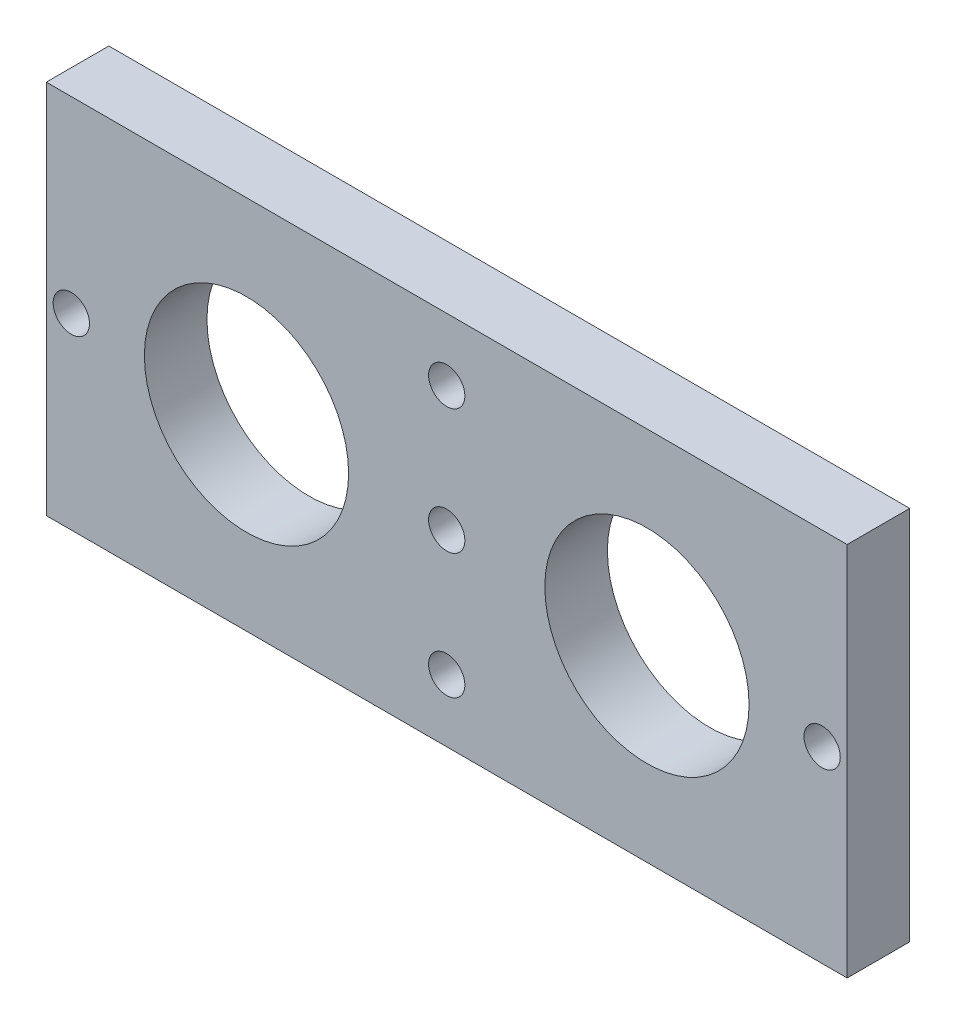
ISO-10303-21;
HEADER;
FILE_DESCRIPTION(('STEP AP214'),'2;1');
FILE_NAME('part.step','',(''),(''),'','','');
FILE_SCHEMA(('AUTOMOTIVE_DESIGN { 1 0 10303 214 1 1 1 1 }'));
ENDSEC;
DATA;
#1=APPLICATION_CONTEXT('core data for automotive mechanical design processes');
#2=APPLICATION_PROTOCOL_DEFINITION('international standard','automotive_design',2000,#1);
#3=PRODUCT_CONTEXT('',#1,'mechanical');
#4=PRODUCT('Part','Part','',(#3));
#5=PRODUCT_RELATED_PRODUCT_CATEGORY('part','',(#4));
#6=PRODUCT_DEFINITION_FORMATION('','',#4);
#7=PRODUCT_DEFINITION_CONTEXT('part definition',#1,'design');
#8=PRODUCT_DEFINITION('design','',#6,#7);
#9=PRODUCT_DEFINITION_SHAPE('','',#8);
#10=(LENGTH_UNIT() NAMED_UNIT(*) SI_UNIT(.MILLI.,.METRE.));
#11=(NAMED_UNIT(*) PLANE_ANGLE_UNIT() SI_UNIT($,.RADIAN.));
#12=(NAMED_UNIT(*) SI_UNIT($,.STERADIAN.) SOLID_ANGLE_UNIT());
#13=UNCERTAINTY_MEASURE_WITH_UNIT(LENGTH_MEASURE(1.E-05),#10,'distance_accuracy_value','');
#14=(GEOMETRIC_REPRESENTATION_CONTEXT(3) GLOBAL_UNCERTAINTY_ASSIGNED_CONTEXT((#13)) GLOBAL_UNIT_ASSIGNED_CONTEXT((#10,
#11,#12)) REPRESENTATION_CONTEXT('',''));
#15=CARTESIAN_POINT('',(0.,0.,0.));
#16=DIRECTION('',(0.,0.,1.));
#17=DIRECTION('',(1.,0.,0.));
#18=AXIS2_PLACEMENT_3D('',#15,#16,#17);
#19=CARTESIAN_POINT('',(0.,0.,5.));
#20=DIRECTION('',(0.,0.,1.));
#21=DIRECTION('',(1.,0.,0.));
#22=AXIS2_PLACEMENT_3D('',#19,#20,#21);
#23=PLANE('',#22);
#24=CARTESIAN_POINT('',(23.1158708144224,5.41513714750296,5.));
#25=DIRECTION('',(0.,0.,1.));
#26=DIRECTION('',(1.,0.,0.));
#27=AXIS2_PLACEMENT_3D('',#24,#25,#26);
#28=CIRCLE('',#27,1.45);
#29=CARTESIAN_POINT('',(24.5658708144224,5.41513714750296,5.));
#30=VERTEX_POINT('',#29);
#31=EDGE_CURVE('E325',#30,#30,#28,.T.);
#32=ORIENTED_EDGE('',*,*,#31,.F.);
#33=EDGE_LOOP('',(#32));
#34=FACE_BOUND('',#33,.T.);
#35=CARTESIAN_POINT('',(-6.88412918557765,15.415137147503,5.));
#36=DIRECTION('',(0.,0.,1.));
#37=DIRECTION('',(1.,0.,0.));
#38=AXIS2_PLACEMENT_3D('',#35,#36,#37);
#39=CIRCLE('',#38,1.45);
#40=CARTESIAN_POINT('',(-5.43412918557764,15.415137147503,5.));
#41=VERTEX_POINT('',#40);
#42=EDGE_CURVE('E327',#41,#41,#39,.T.);
#43=ORIENTED_EDGE('',*,*,#42,.F.);
#44=EDGE_LOOP('',(#43));
#45=FACE_BOUND('',#44,.T.);
#46=CARTESIAN_POINT('',(-36.8841291855776,5.41513714750296,5.));
#47=DIRECTION('',(0.,0.,1.));
#48=DIRECTION('',(1.,0.,0.));
#49=AXIS2_PLACEMENT_3D('',#46,#47,#48);
#50=CIRCLE('',#49,1.45);
#51=CARTESIAN_POINT('',(-35.4341291855776,5.41513714750296,5.));
#52=VERTEX_POINT('',#51);
#53=EDGE_CURVE('E333',#52,#52,#50,.T.);
#54=ORIENTED_EDGE('',*,*,#53,.F.);
#55=EDGE_LOOP('',(#54));
#56=FACE_BOUND('',#55,.T.);
#57=CARTESIAN_POINT('',(-6.88412918557764,-4.58486285249704,5.));
#58=DIRECTION('',(0.,0.,1.));
#59=DIRECTION('',(1.,0.,0.));
#60=AXIS2_PLACEMENT_3D('',#57,#58,#59);
#61=CIRCLE('',#60,1.45);
#62=CARTESIAN_POINT('',(-5.43412918557764,-4.58486285249704,5.));
#63=VERTEX_POINT('',#62);
#64=EDGE_CURVE('E336',#63,#63,#61,.T.);
#65=ORIENTED_EDGE('',*,*,#64,.F.);
#66=EDGE_LOOP('',(#65));
#67=FACE_BOUND('',#66,.T.);
#68=CARTESIAN_POINT('',(-6.88412918557764,5.41513714750296,5.));
#69=DIRECTION('',(0.,0.,1.));
#70=DIRECTION('',(1.,0.,0.));
#71=AXIS2_PLACEMENT_3D('',#68,#69,#70);
#72=CIRCLE('',#71,1.45);
#73=CARTESIAN_POINT('',(-5.43412918557764,5.41513714750296,5.));
#74=VERTEX_POINT('',#73);
#75=EDGE_CURVE('E135',#74,#74,#72,.T.);
#76=ORIENTED_EDGE('',*,*,#75,.F.);
#77=EDGE_LOOP('',(#76));
#78=FACE_BOUND('',#77,.T.);
#79=CARTESIAN_POINT('',(9.11587081442235,5.41513714750296,5.));
#80=DIRECTION('',(0.,0.,1.));
#81=DIRECTION('',(1.,0.,0.));
#82=AXIS2_PLACEMENT_3D('',#79,#80,#81);
#83=CIRCLE('',#82,8.16);
#84=CARTESIAN_POINT('',(17.2758708144224,5.41513714750296,5.));
#85=VERTEX_POINT('',#84);
#86=EDGE_CURVE('E119',#85,#85,#83,.T.);
#87=ORIENTED_EDGE('',*,*,#86,.F.);
#88=EDGE_LOOP('',(#87));
#89=FACE_BOUND('',#88,.T.);
#90=DIRECTION('',(0.,1.,0.));
#91=VECTOR('',#90,1.);
#92=CARTESIAN_POINT('',(25.1158708144224,20.415137147503,5.));
#93=LINE('',#92,#91);
#94=CARTESIAN_POINT('',(25.1158708144224,-9.58486285249704,5.));
#95=VERTEX_POINT('',#94);
#96=CARTESIAN_POINT('',(25.1158708144224,20.415137147503,5.));
#97=VERTEX_POINT('',#96);
#98=EDGE_CURVE('E98',#95,#97,#93,.T.);
#99=ORIENTED_EDGE('',*,*,#98,.T.);
#100=DIRECTION('',(-1.,0.,0.));
#101=VECTOR('',#100,1.);
#102=CARTESIAN_POINT('',(-38.8841291855776,20.415137147503,5.));
#103=LINE('',#102,#101);
#104=CARTESIAN_POINT('',(-38.8841291855776,20.415137147503,5.));
#105=VERTEX_POINT('',#104);
#106=EDGE_CURVE('E93',#97,#105,#103,.T.);
#107=ORIENTED_EDGE('',*,*,#106,.T.);
#108=DIRECTION('',(0.,-1.,0.));
#109=VECTOR('',#108,1.);
#110=CARTESIAN_POINT('',(-38.8841291855776,20.415137147503,5.));
#111=LINE('',#110,#109);
#112=CARTESIAN_POINT('',(-38.8841291855776,-9.58486285249704,5.));
#113=VERTEX_POINT('',#112);
#114=EDGE_CURVE('E96',#105,#113,#111,.T.);
#115=ORIENTED_EDGE('',*,*,#114,.T.);
#116=DIRECTION('',(1.,0.,0.));
#117=VECTOR('',#116,1.);
#118=CARTESIAN_POINT('',(-38.8841291855776,-9.58486285249704,5.));
#119=LINE('',#118,#117);
#120=EDGE_CURVE('E63',#113,#95,#119,.T.);
#121=ORIENTED_EDGE('',*,*,#120,.T.);
#122=EDGE_LOOP('',(#99,#107,#115,#121));
#123=FACE_BOUND('',#122,.T.);
#124=CARTESIAN_POINT('',(-22.8841291855776,5.41513714750296,5.));
#125=DIRECTION('',(0.,0.,1.));
#126=DIRECTION('',(1.,0.,0.));
#127=AXIS2_PLACEMENT_3D('',#124,#125,#126);
#128=CIRCLE('',#127,8.16);
#129=CARTESIAN_POINT('',(-14.7241291855776,5.41513714750296,5.));
#130=VERTEX_POINT('',#129);
#131=EDGE_CURVE('E154',#130,#130,#128,.T.);
#132=ORIENTED_EDGE('',*,*,#131,.F.);
#133=EDGE_LOOP('',(#132));
#134=FACE_BOUND('',#133,.T.);
#135=ADVANCED_FACE('F43',(#34,#45,#56,#67,#78,#89,#123,#134),#23,.T.);
#136=CARTESIAN_POINT('',(0.,0.,0.));
#137=DIRECTION('',(0.,0.,1.));
#138=DIRECTION('',(1.,0.,0.));
#139=AXIS2_PLACEMENT_3D('',#136,#137,#138);
#140=PLANE('',#139);
#141=CARTESIAN_POINT('',(23.1158708144224,5.41513714750296,0.));
#142=DIRECTION('',(0.,0.,1.));
#143=DIRECTION('',(1.,0.,0.));
#144=AXIS2_PLACEMENT_3D('',#141,#142,#143);
#145=CIRCLE('',#144,1.45);
#146=CARTESIAN_POINT('',(24.5658708144224,5.41513714750296,0.));
#147=VERTEX_POINT('',#146);
#148=EDGE_CURVE('E47',#147,#147,#145,.T.);
#149=ORIENTED_EDGE('',*,*,#148,.T.);
#150=EDGE_LOOP('',(#149));
#151=FACE_BOUND('',#150,.T.);
#152=CARTESIAN_POINT('',(-6.88412918557765,15.415137147503,0.));
#153=DIRECTION('',(0.,0.,1.));
#154=DIRECTION('',(1.,0.,0.));
#155=AXIS2_PLACEMENT_3D('',#152,#153,#154);
#156=CIRCLE('',#155,1.45);
#157=CARTESIAN_POINT('',(-5.43412918557764,15.415137147503,0.));
#158=VERTEX_POINT('',#157);
#159=EDGE_CURVE('E142',#158,#158,#156,.T.);
#160=ORIENTED_EDGE('',*,*,#159,.T.);
#161=EDGE_LOOP('',(#160));
#162=FACE_BOUND('',#161,.T.);
#163=CARTESIAN_POINT('',(-36.8841291855776,5.41513714750296,0.));
#164=DIRECTION('',(0.,0.,1.));
#165=DIRECTION('',(1.,0.,0.));
#166=AXIS2_PLACEMENT_3D('',#163,#164,#165);
#167=CIRCLE('',#166,1.45);
#168=CARTESIAN_POINT('',(-35.4341291855776,5.41513714750296,0.));
#169=VERTEX_POINT('',#168);
#170=EDGE_CURVE('E139',#169,#169,#167,.T.);
#171=ORIENTED_EDGE('',*,*,#170,.T.);
#172=EDGE_LOOP('',(#171));
#173=FACE_BOUND('',#172,.T.);
#174=CARTESIAN_POINT('',(-6.88412918557764,-4.58486285249704,0.));
#175=DIRECTION('',(0.,0.,1.));
#176=DIRECTION('',(1.,0.,0.));
#177=AXIS2_PLACEMENT_3D('',#174,#175,#176);
#178=CIRCLE('',#177,1.45);
#179=CARTESIAN_POINT('',(-5.43412918557764,-4.58486285249704,0.));
#180=VERTEX_POINT('',#179);
#181=EDGE_CURVE('E134',#180,#180,#178,.T.);
#182=ORIENTED_EDGE('',*,*,#181,.T.);
#183=EDGE_LOOP('',(#182));
#184=FACE_BOUND('',#183,.T.);
#185=CARTESIAN_POINT('',(-6.88412918557764,5.41513714750296,0.));
#186=DIRECTION('',(0.,0.,1.));
#187=DIRECTION('',(1.,0.,0.));
#188=AXIS2_PLACEMENT_3D('',#185,#186,#187);
#189=CIRCLE('',#188,1.45);
#190=CARTESIAN_POINT('',(-5.43412918557764,5.41513714750296,0.));
#191=VERTEX_POINT('',#190);
#192=EDGE_CURVE('E130',#191,#191,#189,.T.);
#193=ORIENTED_EDGE('',*,*,#192,.T.);
#194=EDGE_LOOP('',(#193));
#195=FACE_BOUND('',#194,.T.);
#196=DIRECTION('',(0.,1.,0.));
#197=VECTOR('',#196,1.);
#198=CARTESIAN_POINT('',(25.1158708144224,20.415137147503,0.));
#199=LINE('',#198,#197);
#200=CARTESIAN_POINT('',(25.1158708144224,-9.58486285249704,0.));
#201=VERTEX_POINT('',#200);
#202=CARTESIAN_POINT('',(25.1158708144224,20.415137147503,0.));
#203=VERTEX_POINT('',#202);
#204=EDGE_CURVE('E115',#201,#203,#199,.T.);
#205=ORIENTED_EDGE('',*,*,#204,.F.);
#206=DIRECTION('',(1.,0.,0.));
#207=VECTOR('',#206,1.);
#208=CARTESIAN_POINT('',(-38.8841291855776,-9.58486285249704,0.));
#209=LINE('',#208,#207);
#210=CARTESIAN_POINT('',(-38.8841291855776,-9.58486285249704,0.));
#211=VERTEX_POINT('',#210);
#212=EDGE_CURVE('E86',#211,#201,#209,.T.);
#213=ORIENTED_EDGE('',*,*,#212,.F.);
#214=DIRECTION('',(0.,-1.,0.));
#215=VECTOR('',#214,1.);
#216=CARTESIAN_POINT('',(-38.8841291855776,20.415137147503,0.));
#217=LINE('',#216,#215);
#218=CARTESIAN_POINT('',(-38.8841291855776,20.415137147503,0.));
#219=VERTEX_POINT('',#218);
#220=EDGE_CURVE('E80',#219,#211,#217,.T.);
#221=ORIENTED_EDGE('',*,*,#220,.F.);
#222=DIRECTION('',(-1.,0.,0.));
#223=VECTOR('',#222,1.);
#224=CARTESIAN_POINT('',(-38.8841291855776,20.415137147503,0.));
#225=LINE('',#224,#223);
#226=EDGE_CURVE('E103',#203,#219,#225,.T.);
#227=ORIENTED_EDGE('',*,*,#226,.F.);
#228=EDGE_LOOP('',(#205,#213,#221,#227));
#229=FACE_BOUND('',#228,.T.);
#230=CARTESIAN_POINT('',(9.11587081442235,5.41513714750296,0.));
#231=DIRECTION('',(0.,0.,1.));
#232=DIRECTION('',(1.,0.,0.));
#233=AXIS2_PLACEMENT_3D('',#230,#231,#232);
#234=CIRCLE('',#233,8.16);
#235=CARTESIAN_POINT('',(17.2758708144224,5.41513714750296,0.));
#236=VERTEX_POINT('',#235);
#237=EDGE_CURVE('E160',#236,#236,#234,.T.);
#238=ORIENTED_EDGE('',*,*,#237,.T.);
#239=EDGE_LOOP('',(#238));
#240=FACE_BOUND('',#239,.T.);
#241=CARTESIAN_POINT('',(-22.8841291855776,5.41513714750296,0.));
#242=DIRECTION('',(0.,0.,1.));
#243=DIRECTION('',(1.,0.,0.));
#244=AXIS2_PLACEMENT_3D('',#241,#242,#243);
#245=CIRCLE('',#244,8.16);
#246=CARTESIAN_POINT('',(-14.7241291855776,5.41513714750296,0.));
#247=VERTEX_POINT('',#246);
#248=EDGE_CURVE('E149',#247,#247,#245,.T.);
#249=ORIENTED_EDGE('',*,*,#248,.T.);
#250=EDGE_LOOP('',(#249));
#251=FACE_BOUND('',#250,.T.);
#252=ADVANCED_FACE('F172',(#151,#162,#173,#184,#195,#229,#240,#251),#140,.F.);
#253=CARTESIAN_POINT('',(25.1158708144224,20.415137147503,5.));
#254=DIRECTION('',(-1.,0.,0.));
#255=DIRECTION('',(0.,0.,1.));
#256=AXIS2_PLACEMENT_3D('',#253,#254,#255);
#257=PLANE('',#256);
#258=ORIENTED_EDGE('',*,*,#204,.T.);
#259=DIRECTION('',(0.,0.,-1.));
#260=VECTOR('',#259,1.);
#261=CARTESIAN_POINT('',(25.1158708144224,20.415137147503,5.));
#262=LINE('',#261,#260);
#263=EDGE_CURVE('E11',#97,#203,#262,.T.);
#264=ORIENTED_EDGE('',*,*,#263,.F.);
#265=ORIENTED_EDGE('',*,*,#98,.F.);
#266=DIRECTION('',(0.,0.,-1.));
#267=VECTOR('',#266,1.);
#268=CARTESIAN_POINT('',(25.1158708144224,-9.58486285249704,5.));
#269=LINE('',#268,#267);
#270=EDGE_CURVE('E111',#95,#201,#269,.T.);
#271=ORIENTED_EDGE('',*,*,#270,.T.);
#272=EDGE_LOOP('',(#258,#264,#265,#271));
#273=FACE_BOUND('',#272,.T.);
#274=ADVANCED_FACE('F45',(#273),#257,.F.);
#275=CARTESIAN_POINT('',(-38.8841291855776,20.415137147503,5.));
#276=DIRECTION('',(0.,-1.,0.));
#277=DIRECTION('',(0.,0.,-1.));
#278=AXIS2_PLACEMENT_3D('',#275,#276,#277);
#279=PLANE('',#278);
#280=ORIENTED_EDGE('',*,*,#226,.T.);
#281=DIRECTION('',(0.,0.,-1.));
#282=VECTOR('',#281,1.);
#283=CARTESIAN_POINT('',(-38.8841291855776,20.415137147503,5.));
#284=LINE('',#283,#282);
#285=EDGE_CURVE('E54',#105,#219,#284,.T.);
#286=ORIENTED_EDGE('',*,*,#285,.F.);
#287=ORIENTED_EDGE('',*,*,#106,.F.);
#288=ORIENTED_EDGE('',*,*,#263,.T.);
#289=EDGE_LOOP('',(#280,#286,#287,#288));
#290=FACE_BOUND('',#289,.T.);
#291=ADVANCED_FACE('F102',(#290),#279,.F.);
#292=CARTESIAN_POINT('',(-38.8841291855776,20.415137147503,5.));
#293=DIRECTION('',(1.,0.,0.));
#294=DIRECTION('',(0.,0.,-1.));
#295=AXIS2_PLACEMENT_3D('',#292,#293,#294);
#296=PLANE('',#295);
#297=ORIENTED_EDGE('',*,*,#220,.T.);
#298=DIRECTION('',(0.,0.,-1.));
#299=VECTOR('',#298,1.);
#300=CARTESIAN_POINT('',(-38.8841291855776,-9.58486285249704,5.));
#301=LINE('',#300,#299);
#302=EDGE_CURVE('E105',#113,#211,#301,.T.);
#303=ORIENTED_EDGE('',*,*,#302,.F.);
#304=ORIENTED_EDGE('',*,*,#114,.F.);
#305=ORIENTED_EDGE('',*,*,#285,.T.);
#306=EDGE_LOOP('',(#297,#303,#304,#305));
#307=FACE_BOUND('',#306,.T.);
#308=ADVANCED_FACE('F107',(#307),#296,.F.);
#309=CARTESIAN_POINT('',(-38.8841291855776,-9.58486285249704,5.));
#310=DIRECTION('',(0.,1.,0.));
#311=DIRECTION('',(0.,0.,1.));
#312=AXIS2_PLACEMENT_3D('',#309,#310,#311);
#313=PLANE('',#312);
#314=ORIENTED_EDGE('',*,*,#212,.T.);
#315=ORIENTED_EDGE('',*,*,#270,.F.);
#316=ORIENTED_EDGE('',*,*,#120,.F.);
#317=ORIENTED_EDGE('',*,*,#302,.T.);
#318=EDGE_LOOP('',(#314,#315,#316,#317));
#319=FACE_BOUND('',#318,.T.);
#320=ADVANCED_FACE('F177',(#319),#313,.F.);
#321=CARTESIAN_POINT('',(9.11587081442235,5.41513714750296,5.));
#322=DIRECTION('',(0.,0.,-1.));
#323=DIRECTION('',(-1.,0.,0.));
#324=AXIS2_PLACEMENT_3D('',#321,#322,#323);
#325=CYLINDRICAL_SURFACE('',#324,8.16);
#326=ORIENTED_EDGE('',*,*,#86,.T.);
#327=EDGE_LOOP('',(#326));
#328=FACE_BOUND('',#327,.T.);
#329=ORIENTED_EDGE('',*,*,#237,.F.);
#330=EDGE_LOOP('',(#329));
#331=FACE_BOUND('',#330,.T.);
#332=ADVANCED_FACE('F174',(#328,#331),#325,.F.);
#333=CARTESIAN_POINT('',(-22.8841291855776,5.41513714750296,5.));
#334=DIRECTION('',(0.,0.,-1.));
#335=DIRECTION('',(-1.,0.,0.));
#336=AXIS2_PLACEMENT_3D('',#333,#334,#335);
#337=CYLINDRICAL_SURFACE('',#336,8.16);
#338=ORIENTED_EDGE('',*,*,#131,.T.);
#339=EDGE_LOOP('',(#338));
#340=FACE_BOUND('',#339,.T.);
#341=ORIENTED_EDGE('',*,*,#248,.F.);
#342=EDGE_LOOP('',(#341));
#343=FACE_BOUND('',#342,.T.);
#344=ADVANCED_FACE('F176',(#340,#343),#337,.F.);
#345=CARTESIAN_POINT('',(-6.88412918557764,5.41513714750296,-5.));
#346=DIRECTION('',(0.,0.,1.));
#347=DIRECTION('',(1.,0.,0.));
#348=AXIS2_PLACEMENT_3D('',#345,#346,#347);
#349=CYLINDRICAL_SURFACE('',#348,1.45);
#350=ORIENTED_EDGE('',*,*,#75,.T.);
#351=EDGE_LOOP('',(#350));
#352=FACE_BOUND('',#351,.T.);
#353=ORIENTED_EDGE('',*,*,#192,.F.);
#354=EDGE_LOOP('',(#353));
#355=FACE_BOUND('',#354,.T.);
#356=ADVANCED_FACE('F184',(#352,#355),#349,.F.);
#357=CARTESIAN_POINT('',(-6.88412918557764,-4.58486285249704,-5.));
#358=DIRECTION('',(0.,0.,1.));
#359=DIRECTION('',(1.,0.,0.));
#360=AXIS2_PLACEMENT_3D('',#357,#358,#359);
#361=CYLINDRICAL_SURFACE('',#360,1.45);
#362=ORIENTED_EDGE('',*,*,#64,.T.);
#363=EDGE_LOOP('',(#362));
#364=FACE_BOUND('',#363,.T.);
#365=ORIENTED_EDGE('',*,*,#181,.F.);
#366=EDGE_LOOP('',(#365));
#367=FACE_BOUND('',#366,.T.);
#368=ADVANCED_FACE('F225',(#364,#367),#361,.F.);
#369=CARTESIAN_POINT('',(-36.8841291855776,5.41513714750296,-5.));
#370=DIRECTION('',(0.,0.,1.));
#371=DIRECTION('',(1.,0.,0.));
#372=AXIS2_PLACEMENT_3D('',#369,#370,#371);
#373=CYLINDRICAL_SURFACE('',#372,1.45);
#374=ORIENTED_EDGE('',*,*,#53,.T.);
#375=EDGE_LOOP('',(#374));
#376=FACE_BOUND('',#375,.T.);
#377=ORIENTED_EDGE('',*,*,#170,.F.);
#378=EDGE_LOOP('',(#377));
#379=FACE_BOUND('',#378,.T.);
#380=ADVANCED_FACE('F237',(#376,#379),#373,.F.);
#381=CARTESIAN_POINT('',(-6.88412918557765,15.415137147503,-5.));
#382=DIRECTION('',(0.,0.,1.));
#383=DIRECTION('',(1.,0.,0.));
#384=AXIS2_PLACEMENT_3D('',#381,#382,#383);
#385=CYLINDRICAL_SURFACE('',#384,1.45);
#386=ORIENTED_EDGE('',*,*,#42,.T.);
#387=EDGE_LOOP('',(#386));
#388=FACE_BOUND('',#387,.T.);
#389=ORIENTED_EDGE('',*,*,#159,.F.);
#390=EDGE_LOOP('',(#389));
#391=FACE_BOUND('',#390,.T.);
#392=ADVANCED_FACE('F248',(#388,#391),#385,.F.);
#393=CARTESIAN_POINT('',(23.1158708144224,5.41513714750296,-5.));
#394=DIRECTION('',(0.,0.,1.));
#395=DIRECTION('',(1.,0.,0.));
#396=AXIS2_PLACEMENT_3D('',#393,#394,#395);
#397=CYLINDRICAL_SURFACE('',#396,1.45);
#398=ORIENTED_EDGE('',*,*,#31,.T.);
#399=EDGE_LOOP('',(#398));
#400=FACE_BOUND('',#399,.T.);
#401=ORIENTED_EDGE('',*,*,#148,.F.);
#402=EDGE_LOOP('',(#401));
#403=FACE_BOUND('',#402,.T.);
#404=ADVANCED_FACE('F259',(#400,#403),#397,.F.);
#405=CLOSED_SHELL('',(#135,#252,#274,#291,#308,#320,#332,#344,#356,#368,#380,#392,#404));
#406=MANIFOLD_SOLID_BREP('B2',#405);
#407=ADVANCED_BREP_SHAPE_REPRESENTATION('',(#18,#406),#14);
#408=SHAPE_DEFINITION_REPRESENTATION(#9,#407);
ENDSEC;
END-ISO-10303-21;
